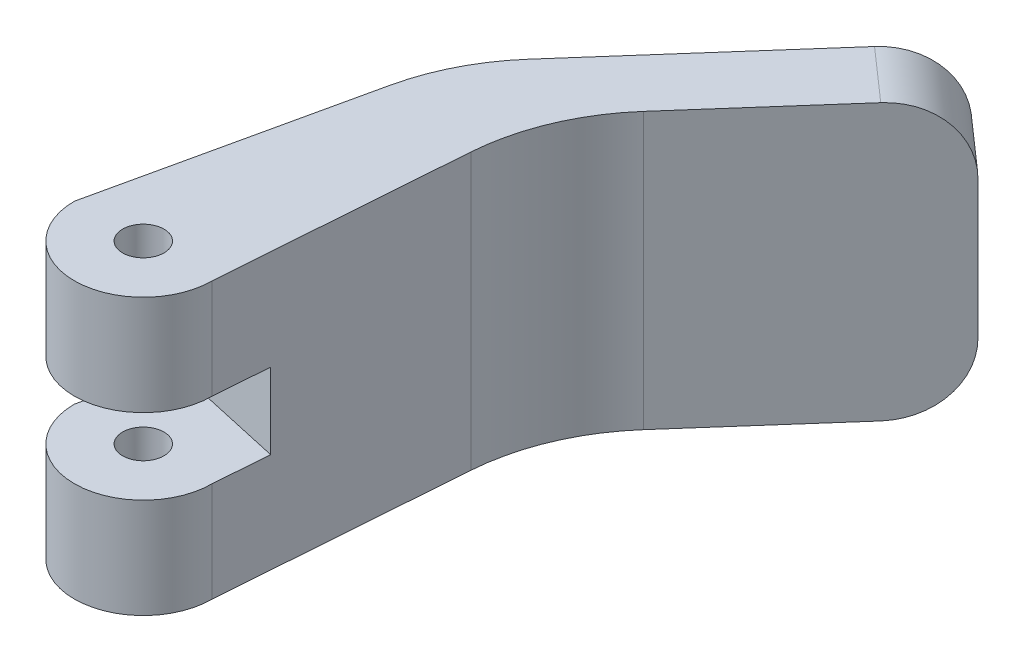
ISO-10303-21;
HEADER;
FILE_DESCRIPTION(('STEP AP214'),'2;1');
FILE_NAME('part.step','',(''),(''),'','','');
FILE_SCHEMA(('AUTOMOTIVE_DESIGN { 1 0 10303 214 1 1 1 1 }'));
ENDSEC;
DATA;
#1=APPLICATION_CONTEXT('core data for automotive mechanical design processes');
#2=APPLICATION_PROTOCOL_DEFINITION('international standard','automotive_design',2000,#1);
#3=PRODUCT_CONTEXT('',#1,'mechanical');
#4=PRODUCT('Part','Part','',(#3));
#5=PRODUCT_RELATED_PRODUCT_CATEGORY('part','',(#4));
#6=PRODUCT_DEFINITION_FORMATION('','',#4);
#7=PRODUCT_DEFINITION_CONTEXT('part definition',#1,'design');
#8=PRODUCT_DEFINITION('design','',#6,#7);
#9=PRODUCT_DEFINITION_SHAPE('','',#8);
#10=(LENGTH_UNIT() NAMED_UNIT(*) SI_UNIT(.MILLI.,.METRE.));
#11=(NAMED_UNIT(*) PLANE_ANGLE_UNIT() SI_UNIT($,.RADIAN.));
#12=(NAMED_UNIT(*) SI_UNIT($,.STERADIAN.) SOLID_ANGLE_UNIT());
#13=UNCERTAINTY_MEASURE_WITH_UNIT(LENGTH_MEASURE(1.E-05),#10,'distance_accuracy_value','');
#14=(GEOMETRIC_REPRESENTATION_CONTEXT(3) GLOBAL_UNCERTAINTY_ASSIGNED_CONTEXT((#13)) GLOBAL_UNIT_ASSIGNED_CONTEXT((#10,
#11,#12)) REPRESENTATION_CONTEXT('',''));
#15=CARTESIAN_POINT('',(0.,0.,0.));
#16=DIRECTION('',(0.,0.,1.));
#17=DIRECTION('',(1.,0.,0.));
#18=AXIS2_PLACEMENT_3D('',#15,#16,#17);
#19=CARTESIAN_POINT('',(0.,40.,0.));
#20=DIRECTION('',(0.,-1.,0.));
#21=DIRECTION('',(0.,0.,-1.));
#22=AXIS2_PLACEMENT_3D('',#19,#20,#21);
#23=CYLINDRICAL_SURFACE('',#22,10.);
#24=DIRECTION('',(0.,-1.,0.));
#25=VECTOR('',#24,1.);
#26=CARTESIAN_POINT('',(-10.,40.,0.));
#27=LINE('',#26,#25);
#28=CARTESIAN_POINT('',(-10.,40.,0.));
#29=VERTEX_POINT('',#28);
#30=CARTESIAN_POINT('',(-10.,25.5,0.));
#31=VERTEX_POINT('',#30);
#32=EDGE_CURVE('E205',#29,#31,#27,.T.);
#33=ORIENTED_EDGE('',*,*,#32,.T.);
#34=CARTESIAN_POINT('',(0.,25.5,0.));
#35=DIRECTION('',(0.,1.,0.));
#36=DIRECTION('',(0.,0.,1.));
#37=AXIS2_PLACEMENT_3D('',#34,#35,#36);
#38=CIRCLE('',#37,10.);
#39=CARTESIAN_POINT('',(10.,25.5,0.));
#40=VERTEX_POINT('',#39);
#41=EDGE_CURVE('E173',#31,#40,#38,.T.);
#42=ORIENTED_EDGE('',*,*,#41,.T.);
#43=DIRECTION('',(0.,-1.,0.));
#44=VECTOR('',#43,1.);
#45=CARTESIAN_POINT('',(10.,40.,0.));
#46=LINE('',#45,#44);
#47=CARTESIAN_POINT('',(10.,40.,0.));
#48=VERTEX_POINT('',#47);
#49=EDGE_CURVE('E215',#48,#40,#46,.T.);
#50=ORIENTED_EDGE('',*,*,#49,.F.);
#51=CARTESIAN_POINT('',(0.,40.,0.));
#52=DIRECTION('',(0.,1.,0.));
#53=DIRECTION('',(0.,0.,1.));
#54=AXIS2_PLACEMENT_3D('',#51,#52,#53);
#55=CIRCLE('',#54,10.);
#56=EDGE_CURVE('E181',#29,#48,#55,.T.);
#57=ORIENTED_EDGE('',*,*,#56,.F.);
#58=EDGE_LOOP('',(#33,#42,#50,#57));
#59=FACE_BOUND('',#58,.T.);
#60=ADVANCED_FACE('F38',(#59),#23,.T.);
#61=CARTESIAN_POINT('',(0.,-10.,0.));
#62=DIRECTION('',(0.,1.,0.));
#63=DIRECTION('',(0.,0.,1.));
#64=AXIS2_PLACEMENT_3D('',#61,#62,#63);
#65=CYLINDRICAL_SURFACE('',#64,3.);
#66=CARTESIAN_POINT('',(0.,25.5,0.));
#67=DIRECTION('',(0.,1.,0.));
#68=DIRECTION('',(0.,0.,1.));
#69=AXIS2_PLACEMENT_3D('',#66,#67,#68);
#70=CIRCLE('',#69,3.);
#71=CARTESIAN_POINT('',(0.,25.5,3.));
#72=VERTEX_POINT('',#71);
#73=EDGE_CURVE('E42',#72,#72,#70,.F.);
#74=ORIENTED_EDGE('',*,*,#73,.T.);
#75=EDGE_LOOP('',(#74));
#76=FACE_BOUND('',#75,.T.);
#77=CARTESIAN_POINT('',(0.,40.,0.));
#78=DIRECTION('',(0.,1.,0.));
#79=DIRECTION('',(0.,0.,1.));
#80=AXIS2_PLACEMENT_3D('',#77,#78,#79);
#81=CIRCLE('',#80,3.);
#82=CARTESIAN_POINT('',(0.,40.,3.));
#83=VERTEX_POINT('',#82);
#84=EDGE_CURVE('E177',#83,#83,#81,.T.);
#85=ORIENTED_EDGE('',*,*,#84,.T.);
#86=EDGE_LOOP('',(#85));
#87=FACE_BOUND('',#86,.T.);
#88=ADVANCED_FACE('F269',(#76,#87),#65,.F.);
#89=CARTESIAN_POINT('',(10.,14.5,0.));
#90=VERTEX_POINT('',#89);
#91=CARTESIAN_POINT('',(10.,0.,0.));
#92=VERTEX_POINT('',#91);
#93=EDGE_CURVE('E214',#90,#92,#46,.T.);
#94=ORIENTED_EDGE('',*,*,#93,.F.);
#95=CARTESIAN_POINT('',(0.,14.5,0.));
#96=DIRECTION('',(0.,-1.,0.));
#97=DIRECTION('',(0.,0.,-1.));
#98=AXIS2_PLACEMENT_3D('',#95,#96,#97);
#99=CIRCLE('',#98,10.);
#100=CARTESIAN_POINT('',(-10.,14.5,0.));
#101=VERTEX_POINT('',#100);
#102=EDGE_CURVE('E168',#90,#101,#99,.T.);
#103=ORIENTED_EDGE('',*,*,#102,.T.);
#104=CARTESIAN_POINT('',(-10.,0.,0.));
#105=VERTEX_POINT('',#104);
#106=EDGE_CURVE('E162',#101,#105,#27,.T.);
#107=ORIENTED_EDGE('',*,*,#106,.T.);
#108=CARTESIAN_POINT('',(0.,0.,0.));
#109=DIRECTION('',(0.,1.,0.));
#110=DIRECTION('',(0.,0.,1.));
#111=AXIS2_PLACEMENT_3D('',#108,#109,#110);
#112=CIRCLE('',#111,10.);
#113=EDGE_CURVE('E194',#105,#92,#112,.T.);
#114=ORIENTED_EDGE('',*,*,#113,.T.);
#115=EDGE_LOOP('',(#94,#103,#107,#114));
#116=FACE_BOUND('',#115,.T.);
#117=ADVANCED_FACE('F272',(#116),#23,.T.);
#118=CARTESIAN_POINT('',(13.3240992667123,40.,-45.));
#119=DIRECTION('',(-0.997282809774378,0.,-0.0736681568150167));
#120=DIRECTION('',(-0.0736681568150167,0.,0.997282809774378));
#121=AXIS2_PLACEMENT_3D('',#118,#119,#120);
#122=PLANE('',#121);
#123=ORIENTED_EDGE('',*,*,#49,.T.);
#124=DIRECTION('',(0.0736681568150167,0.,-0.997282809774378));
#125=VECTOR('',#124,1.);
#126=CARTESIAN_POINT('',(13.3240992667123,25.5,-45.));
#127=LINE('',#126,#125);
#128=CARTESIAN_POINT('',(10.5829852413294,25.5,-7.89216378780778));
#129=VERTEX_POINT('',#128);
#130=EDGE_CURVE('E170',#40,#129,#127,.T.);
#131=ORIENTED_EDGE('',*,*,#130,.T.);
#132=DIRECTION('',(0.,-1.,0.));
#133=VECTOR('',#132,1.);
#134=CARTESIAN_POINT('',(10.5829852413294,40.,-7.89216378780778));
#135=LINE('',#134,#133);
#136=CARTESIAN_POINT('',(10.5829852413294,14.5,-7.89216378780778));
#137=VERTEX_POINT('',#136);
#138=EDGE_CURVE('E175',#129,#137,#135,.T.);
#139=ORIENTED_EDGE('',*,*,#138,.T.);
#140=DIRECTION('',(-0.0736681568150167,0.,0.997282809774378));
#141=VECTOR('',#140,1.);
#142=CARTESIAN_POINT('',(13.3240992667123,14.5,-45.));
#143=LINE('',#142,#141);
#144=EDGE_CURVE('E149',#137,#90,#143,.T.);
#145=ORIENTED_EDGE('',*,*,#144,.T.);
#146=ORIENTED_EDGE('',*,*,#93,.T.);
#147=DIRECTION('',(0.0736681568150167,0.,-0.997282809774378));
#148=VECTOR('',#147,1.);
#149=CARTESIAN_POINT('',(13.3240992667123,0.,-45.));
#150=LINE('',#149,#148);
#151=CARTESIAN_POINT('',(12.5816277252217,0.,-34.9487901274013));
#152=VERTEX_POINT('',#151);
#153=EDGE_CURVE('E197',#92,#152,#150,.T.);
#154=ORIENTED_EDGE('',*,*,#153,.T.);
#155=DIRECTION('',(0.,-1.,0.));
#156=VECTOR('',#155,1.);
#157=CARTESIAN_POINT('',(12.5816277252217,40.,-34.9487901274013));
#158=LINE('',#157,#156);
#159=CARTESIAN_POINT('',(12.5816277252217,40.,-34.9487901274013));
#160=VERTEX_POINT('',#159);
#161=EDGE_CURVE('E63',#152,#160,#158,.F.);
#162=ORIENTED_EDGE('',*,*,#161,.T.);
#163=DIRECTION('',(0.0736681568150167,0.,-0.997282809774378));
#164=VECTOR('',#163,1.);
#165=CARTESIAN_POINT('',(13.3240992667123,40.,-45.));
#166=LINE('',#165,#164);
#167=EDGE_CURVE('E184',#48,#160,#166,.T.);
#168=ORIENTED_EDGE('',*,*,#167,.F.);
#169=EDGE_LOOP('',(#123,#131,#139,#145,#146,#154,#162,#168));
#170=FACE_BOUND('',#169,.T.);
#171=ADVANCED_FACE('F281',(#170),#122,.F.);
#172=CARTESIAN_POINT('',(42.7260146225168,40.,-78.39152010292));
#173=DIRECTION('',(-0.750519776221055,0.,-0.660847989707995));
#174=DIRECTION('',(-0.660847989707995,0.,0.750519776221055));
#175=AXIS2_PLACEMENT_3D('',#172,#173,#174);
#176=PLANE('',#175);
#177=DIRECTION('',(0.660847989707995,0.,-0.750519776221055));
#178=VECTOR('',#177,1.);
#179=CARTESIAN_POINT('',(42.7260146225168,40.,-78.39152010292));
#180=LINE('',#179,#178);
#181=CARTESIAN_POINT('',(19.9845187318214,40.,-52.5641851141907));
#182=VERTEX_POINT('',#181);
#183=CARTESIAN_POINT('',(36.1175347254369,40.,-70.8863223407095));
#184=VERTEX_POINT('',#183);
#185=EDGE_CURVE('E187',#182,#184,#180,.T.);
#186=ORIENTED_EDGE('',*,*,#185,.F.);
#187=DIRECTION('',(0.,-1.,0.));
#188=VECTOR('',#187,1.);
#189=CARTESIAN_POINT('',(19.9845187318214,0.,-52.5641851141907));
#190=LINE('',#189,#188);
#191=CARTESIAN_POINT('',(19.9845187318214,0.,-52.5641851141907));
#192=VERTEX_POINT('',#191);
#193=EDGE_CURVE('E247',#182,#192,#190,.T.);
#194=ORIENTED_EDGE('',*,*,#193,.T.);
#195=DIRECTION('',(0.660847989707995,0.,-0.750519776221055));
#196=VECTOR('',#195,1.);
#197=CARTESIAN_POINT('',(42.7260146225168,0.,-78.39152010292));
#198=LINE('',#197,#196);
#199=CARTESIAN_POINT('',(36.1175347254369,0.,-70.8863223407095));
#200=VERTEX_POINT('',#199);
#201=EDGE_CURVE('E199',#192,#200,#198,.T.);
#202=ORIENTED_EDGE('',*,*,#201,.T.);
#203=CARTESIAN_POINT('',(36.1175347254369,10.,-70.8863223407095));
#204=DIRECTION('',(-0.750519776221055,0.,-0.660847989707995));
#205=DIRECTION('',(-0.660847989707995,0.,0.750519776221055));
#206=AXIS2_PLACEMENT_3D('',#203,#204,#205);
#207=CIRCLE('',#206,10.);
#208=CARTESIAN_POINT('',(42.7260146225168,10.,-78.39152010292));
#209=VERTEX_POINT('',#208);
#210=EDGE_CURVE('E233',#200,#209,#207,.F.);
#211=ORIENTED_EDGE('',*,*,#210,.T.);
#212=DIRECTION('',(0.,-1.,0.));
#213=VECTOR('',#212,1.);
#214=CARTESIAN_POINT('',(42.7260146225168,40.,-78.39152010292));
#215=LINE('',#214,#213);
#216=CARTESIAN_POINT('',(42.7260146225168,30.,-78.39152010292));
#217=VERTEX_POINT('',#216);
#218=EDGE_CURVE('E211',#217,#209,#215,.T.);
#219=ORIENTED_EDGE('',*,*,#218,.F.);
#220=CARTESIAN_POINT('',(36.1175347254369,30.,-70.8863223407095));
#221=DIRECTION('',(-0.750519776221055,0.,-0.660847989707995));
#222=DIRECTION('',(-0.660847989707995,0.,0.750519776221055));
#223=AXIS2_PLACEMENT_3D('',#220,#221,#222);
#224=CIRCLE('',#223,10.);
#225=EDGE_CURVE('E230',#217,#184,#224,.F.);
#226=ORIENTED_EDGE('',*,*,#225,.T.);
#227=EDGE_LOOP('',(#186,#194,#202,#211,#219,#226));
#228=FACE_BOUND('',#227,.T.);
#229=ADVANCED_FACE('F286',(#228),#176,.F.);
#230=CARTESIAN_POINT('',(35.2208168603063,40.,-85.));
#231=DIRECTION('',(-0.660847989707996,0.,0.750519776221054));
#232=DIRECTION('',(0.750519776221054,0.,0.660847989707996));
#233=AXIS2_PLACEMENT_3D('',#230,#231,#232);
#234=PLANE('',#233);
#235=ORIENTED_EDGE('',*,*,#218,.T.);
#236=DIRECTION('',(-0.750519776221054,0.,-0.660847989707996));
#237=VECTOR('',#236,1.);
#238=CARTESIAN_POINT('',(35.2208168603063,10.,-85.));
#239=LINE('',#238,#237);
#240=CARTESIAN_POINT('',(35.2208168603063,10.,-85.));
#241=VERTEX_POINT('',#240);
#242=EDGE_CURVE('E220',#209,#241,#239,.T.);
#243=ORIENTED_EDGE('',*,*,#242,.T.);
#244=DIRECTION('',(0.,-1.,0.));
#245=VECTOR('',#244,1.);
#246=CARTESIAN_POINT('',(35.2208168603063,40.,-85.));
#247=LINE('',#246,#245);
#248=CARTESIAN_POINT('',(35.2208168603063,30.,-85.));
#249=VERTEX_POINT('',#248);
#250=EDGE_CURVE('E208',#249,#241,#247,.T.);
#251=ORIENTED_EDGE('',*,*,#250,.F.);
#252=DIRECTION('',(-0.750519776221054,0.,-0.660847989707996));
#253=VECTOR('',#252,1.);
#254=CARTESIAN_POINT('',(42.7260146225168,30.,-78.39152010292));
#255=LINE('',#254,#253);
#256=EDGE_CURVE('E218',#249,#217,#255,.F.);
#257=ORIENTED_EDGE('',*,*,#256,.T.);
#258=EDGE_LOOP('',(#235,#243,#251,#257));
#259=FACE_BOUND('',#258,.T.);
#260=ADVANCED_FACE('F325',(#259),#234,.F.);
#261=CARTESIAN_POINT('',(0.,40.,-45.));
#262=DIRECTION('',(0.750519776221054,0.,0.660847989707995));
#263=DIRECTION('',(0.660847989707995,0.,-0.750519776221055));
#264=AXIS2_PLACEMENT_3D('',#261,#262,#263);
#265=PLANE('',#264);
#266=DIRECTION('',(-0.660847989707995,0.,0.750519776221055));
#267=VECTOR('',#266,1.);
#268=CARTESIAN_POINT('',(0.,0.,-45.));
#269=LINE('',#268,#267);
#270=CARTESIAN_POINT('',(28.6123369632263,0.,-77.4948022377895));
#271=VERTEX_POINT('',#270);
#272=CARTESIAN_POINT('',(5.0969047384323,0.,-50.7885139446342));
#273=VERTEX_POINT('',#272);
#274=EDGE_CURVE('E201',#271,#273,#269,.T.);
#275=ORIENTED_EDGE('',*,*,#274,.T.);
#276=DIRECTION('',(0.,-1.,0.));
#277=VECTOR('',#276,1.);
#278=CARTESIAN_POINT('',(5.0969047384323,40.,-50.7885139446342));
#279=LINE('',#278,#277);
#280=CARTESIAN_POINT('',(5.0969047384323,40.,-50.7885139446342));
#281=VERTEX_POINT('',#280);
#282=EDGE_CURVE('E243',#273,#281,#279,.F.);
#283=ORIENTED_EDGE('',*,*,#282,.T.);
#284=DIRECTION('',(-0.660847989707995,0.,0.750519776221055));
#285=VECTOR('',#284,1.);
#286=CARTESIAN_POINT('',(0.,40.,-45.));
#287=LINE('',#286,#285);
#288=CARTESIAN_POINT('',(28.6123369632263,40.,-77.4948022377895));
#289=VERTEX_POINT('',#288);
#290=EDGE_CURVE('E189',#289,#281,#287,.T.);
#291=ORIENTED_EDGE('',*,*,#290,.F.);
#292=CARTESIAN_POINT('',(28.6123369632263,30.,-77.4948022377895));
#293=DIRECTION('',(0.750519776221054,0.,0.660847989707995));
#294=DIRECTION('',(0.660847989707995,0.,-0.750519776221055));
#295=AXIS2_PLACEMENT_3D('',#292,#293,#294);
#296=CIRCLE('',#295,10.);
#297=EDGE_CURVE('E223',#289,#249,#296,.F.);
#298=ORIENTED_EDGE('',*,*,#297,.T.);
#299=ORIENTED_EDGE('',*,*,#250,.T.);
#300=CARTESIAN_POINT('',(28.6123369632263,10.,-77.4948022377895));
#301=DIRECTION('',(0.750519776221054,0.,0.660847989707995));
#302=DIRECTION('',(0.660847989707995,0.,-0.750519776221055));
#303=AXIS2_PLACEMENT_3D('',#300,#301,#302);
#304=CIRCLE('',#303,10.);
#305=EDGE_CURVE('E225',#241,#271,#304,.F.);
#306=ORIENTED_EDGE('',*,*,#305,.T.);
#307=EDGE_LOOP('',(#275,#283,#291,#298,#299,#306));
#308=FACE_BOUND('',#307,.T.);
#309=ADVANCED_FACE('F318',(#308),#265,.F.);
#310=CARTESIAN_POINT('',(-10.,40.,0.));
#311=DIRECTION('',(0.976187060183953,0.,0.216930457818656));
#312=DIRECTION('',(0.216930457818656,0.,-0.976187060183953));
#313=AXIS2_PLACEMENT_3D('',#310,#311,#312);
#314=PLANE('',#313);
#315=DIRECTION('',(0.,-1.,0.));
#316=VECTOR('',#315,1.);
#317=CARTESIAN_POINT('',(-7.36010718651932,25.5,-11.8795176606631));
#318=LINE('',#317,#316);
#319=CARTESIAN_POINT('',(-7.36010718651932,25.5,-11.8795176606631));
#320=VERTEX_POINT('',#319);
#321=CARTESIAN_POINT('',(-7.36010718651932,14.5,-11.8795176606631));
#322=VERTEX_POINT('',#321);
#323=EDGE_CURVE('E156',#320,#322,#318,.T.);
#324=ORIENTED_EDGE('',*,*,#323,.F.);
#325=DIRECTION('',(0.216930457818656,0.,-0.976187060183953));
#326=VECTOR('',#325,1.);
#327=CARTESIAN_POINT('',(-11.6987163428924,25.5,7.644223543016));
#328=LINE('',#327,#326);
#329=EDGE_CURVE('E55',#31,#320,#328,.T.);
#330=ORIENTED_EDGE('',*,*,#329,.F.);
#331=ORIENTED_EDGE('',*,*,#32,.F.);
#332=DIRECTION('',(-0.216930457818656,0.,0.976187060183953));
#333=VECTOR('',#332,1.);
#334=CARTESIAN_POINT('',(-10.,40.,0.));
#335=LINE('',#334,#333);
#336=CARTESIAN_POINT('',(-1.67311378045464,40.,-37.4709879879541));
#337=VERTEX_POINT('',#336);
#338=EDGE_CURVE('E192',#337,#29,#335,.T.);
#339=ORIENTED_EDGE('',*,*,#338,.F.);
#340=DIRECTION('',(0.,-1.,0.));
#341=VECTOR('',#340,1.);
#342=CARTESIAN_POINT('',(-1.67311378045465,40.,-37.4709879879541));
#343=LINE('',#342,#341);
#344=CARTESIAN_POINT('',(-1.67311378045464,0.,-37.4709879879541));
#345=VERTEX_POINT('',#344);
#346=EDGE_CURVE('E238',#337,#345,#343,.T.);
#347=ORIENTED_EDGE('',*,*,#346,.T.);
#348=DIRECTION('',(-0.216930457818656,0.,0.976187060183953));
#349=VECTOR('',#348,1.);
#350=CARTESIAN_POINT('',(-10.,0.,0.));
#351=LINE('',#350,#349);
#352=EDGE_CURVE('E185',#345,#105,#351,.T.);
#353=ORIENTED_EDGE('',*,*,#352,.T.);
#354=ORIENTED_EDGE('',*,*,#106,.F.);
#355=DIRECTION('',(-0.216930457818656,0.,0.976187060183953));
#356=VECTOR('',#355,1.);
#357=CARTESIAN_POINT('',(-7.36010718651932,14.5,-11.8795176606631));
#358=LINE('',#357,#356);
#359=EDGE_CURVE('E146',#322,#101,#358,.T.);
#360=ORIENTED_EDGE('',*,*,#359,.F.);
#361=EDGE_LOOP('',(#324,#330,#331,#339,#347,#353,#354,#360));
#362=FACE_BOUND('',#361,.T.);
#363=ADVANCED_FACE('F160',(#362),#314,.F.);
#364=CARTESIAN_POINT('',(0.,40.,0.));
#365=DIRECTION('',(0.,1.,0.));
#366=DIRECTION('',(0.,0.,1.));
#367=AXIS2_PLACEMENT_3D('',#364,#365,#366);
#368=PLANE('',#367);
#369=ORIENTED_EDGE('',*,*,#84,.F.);
#370=EDGE_LOOP('',(#369));
#371=FACE_BOUND('',#370,.T.);
#372=ORIENTED_EDGE('',*,*,#290,.T.);
#373=CARTESIAN_POINT('',(27.6124980250639,40.,-30.9630742533944));
#374=DIRECTION('',(0.,1.,0.));
#375=DIRECTION('',(0.,0.,1.));
#376=AXIS2_PLACEMENT_3D('',#373,#374,#375);
#377=CIRCLE('',#376,30.);
#378=EDGE_CURVE('E245',#281,#337,#377,.T.);
#379=ORIENTED_EDGE('',*,*,#378,.T.);
#380=ORIENTED_EDGE('',*,*,#338,.T.);
#381=ORIENTED_EDGE('',*,*,#56,.T.);
#382=ORIENTED_EDGE('',*,*,#167,.T.);
#383=CARTESIAN_POINT('',(42.500112018453,40.,-32.7387454229508));
#384=DIRECTION('',(0.,1.,0.));
#385=DIRECTION('',(0.,0.,1.));
#386=AXIS2_PLACEMENT_3D('',#383,#384,#385);
#387=CIRCLE('',#386,30.);
#388=EDGE_CURVE('E11',#160,#182,#387,.F.);
#389=ORIENTED_EDGE('',*,*,#388,.T.);
#390=ORIENTED_EDGE('',*,*,#185,.T.);
#391=DIRECTION('',(-0.750519776221054,0.,-0.660847989707996));
#392=VECTOR('',#391,1.);
#393=CARTESIAN_POINT('',(28.6123369632263,40.,-77.4948022377895));
#394=LINE('',#393,#392);
#395=EDGE_CURVE('E235',#184,#289,#394,.T.);
#396=ORIENTED_EDGE('',*,*,#395,.T.);
#397=EDGE_LOOP('',(#372,#379,#380,#381,#382,#389,#390,#396));
#398=FACE_BOUND('',#397,.T.);
#399=ADVANCED_FACE('F303',(#371,#398),#368,.T.);
#400=CARTESIAN_POINT('',(0.,0.,0.));
#401=DIRECTION('',(0.,1.,0.));
#402=DIRECTION('',(0.,0.,1.));
#403=AXIS2_PLACEMENT_3D('',#400,#401,#402);
#404=PLANE('',#403);
#405=CARTESIAN_POINT('',(0.,0.,0.));
#406=DIRECTION('',(0.,1.,0.));
#407=DIRECTION('',(0.,0.,1.));
#408=AXIS2_PLACEMENT_3D('',#405,#406,#407);
#409=CIRCLE('',#408,3.);
#410=CARTESIAN_POINT('',(0.,0.,3.));
#411=VERTEX_POINT('',#410);
#412=EDGE_CURVE('E180',#411,#411,#409,.T.);
#413=ORIENTED_EDGE('',*,*,#412,.T.);
#414=EDGE_LOOP('',(#413));
#415=FACE_BOUND('',#414,.T.);
#416=ORIENTED_EDGE('',*,*,#352,.F.);
#417=CARTESIAN_POINT('',(27.6124980250639,0.,-30.9630742533944));
#418=DIRECTION('',(0.,1.,0.));
#419=DIRECTION('',(0.,0.,1.));
#420=AXIS2_PLACEMENT_3D('',#417,#418,#419);
#421=CIRCLE('',#420,30.);
#422=EDGE_CURVE('E241',#345,#273,#421,.F.);
#423=ORIENTED_EDGE('',*,*,#422,.T.);
#424=ORIENTED_EDGE('',*,*,#274,.F.);
#425=DIRECTION('',(-0.750519776221054,0.,-0.660847989707996));
#426=VECTOR('',#425,1.);
#427=CARTESIAN_POINT('',(50.9314138040564,0.,-57.84239929024));
#428=LINE('',#427,#426);
#429=EDGE_CURVE('E227',#271,#200,#428,.F.);
#430=ORIENTED_EDGE('',*,*,#429,.T.);
#431=ORIENTED_EDGE('',*,*,#201,.F.);
#432=CARTESIAN_POINT('',(42.500112018453,0.,-32.7387454229508));
#433=DIRECTION('',(0.,1.,0.));
#434=DIRECTION('',(0.,0.,1.));
#435=AXIS2_PLACEMENT_3D('',#432,#433,#434);
#436=CIRCLE('',#435,30.);
#437=EDGE_CURVE('E47',#192,#152,#436,.T.);
#438=ORIENTED_EDGE('',*,*,#437,.T.);
#439=ORIENTED_EDGE('',*,*,#153,.F.);
#440=ORIENTED_EDGE('',*,*,#113,.F.);
#441=EDGE_LOOP('',(#416,#423,#424,#430,#431,#438,#439,#440));
#442=FACE_BOUND('',#441,.T.);
#443=ADVANCED_FACE('F292',(#415,#442),#404,.F.);
#444=CARTESIAN_POINT('',(28.6123369632263,10.,-77.4948022377895));
#445=DIRECTION('',(-0.750519776221054,0.,-0.660847989707996));
#446=DIRECTION('',(-0.660847989707996,0.,0.750519776221054));
#447=AXIS2_PLACEMENT_3D('',#444,#445,#446);
#448=CYLINDRICAL_SURFACE('',#447,10.);
#449=ORIENTED_EDGE('',*,*,#210,.F.);
#450=ORIENTED_EDGE('',*,*,#429,.F.);
#451=ORIENTED_EDGE('',*,*,#305,.F.);
#452=ORIENTED_EDGE('',*,*,#242,.F.);
#453=EDGE_LOOP('',(#449,#450,#451,#452));
#454=FACE_BOUND('',#453,.T.);
#455=ADVANCED_FACE('F323',(#454),#448,.T.);
#456=CARTESIAN_POINT('',(50.9314138040564,30.,-57.84239929024));
#457=DIRECTION('',(0.750519776221054,0.,0.660847989707996));
#458=DIRECTION('',(0.660847989707996,0.,-0.750519776221054));
#459=AXIS2_PLACEMENT_3D('',#456,#457,#458);
#460=CYLINDRICAL_SURFACE('',#459,10.);
#461=ORIENTED_EDGE('',*,*,#225,.F.);
#462=ORIENTED_EDGE('',*,*,#256,.F.);
#463=ORIENTED_EDGE('',*,*,#297,.F.);
#464=ORIENTED_EDGE('',*,*,#395,.F.);
#465=EDGE_LOOP('',(#461,#462,#463,#464));
#466=FACE_BOUND('',#465,.T.);
#467=ADVANCED_FACE('F328',(#466),#460,.T.);
#468=CARTESIAN_POINT('',(27.6124980250639,40.,-30.9630742533944));
#469=DIRECTION('',(0.,-1.,0.));
#470=DIRECTION('',(0.,0.,-1.));
#471=AXIS2_PLACEMENT_3D('',#468,#469,#470);
#472=CYLINDRICAL_SURFACE('',#471,30.);
#473=ORIENTED_EDGE('',*,*,#378,.F.);
#474=ORIENTED_EDGE('',*,*,#282,.F.);
#475=ORIENTED_EDGE('',*,*,#422,.F.);
#476=ORIENTED_EDGE('',*,*,#346,.F.);
#477=EDGE_LOOP('',(#473,#474,#475,#476));
#478=FACE_BOUND('',#477,.T.);
#479=ADVANCED_FACE('F313',(#478),#472,.T.);
#480=CARTESIAN_POINT('',(42.500112018453,40.,-32.7387454229508));
#481=DIRECTION('',(0.,1.,0.));
#482=DIRECTION('',(0.,0.,1.));
#483=AXIS2_PLACEMENT_3D('',#480,#481,#482);
#484=CYLINDRICAL_SURFACE('',#483,30.);
#485=ORIENTED_EDGE('',*,*,#388,.F.);
#486=ORIENTED_EDGE('',*,*,#161,.F.);
#487=ORIENTED_EDGE('',*,*,#437,.F.);
#488=ORIENTED_EDGE('',*,*,#193,.F.);
#489=EDGE_LOOP('',(#485,#486,#487,#488));
#490=FACE_BOUND('',#489,.T.);
#491=ADVANCED_FACE('F40',(#490),#484,.F.);
#492=CARTESIAN_POINT('',(0.,14.5,0.));
#493=DIRECTION('',(0.,-1.,0.));
#494=DIRECTION('',(0.,0.,-1.));
#495=AXIS2_PLACEMENT_3D('',#492,#493,#494);
#496=CIRCLE('',#495,3.);
#497=CARTESIAN_POINT('',(0.,14.5,-3.));
#498=VERTEX_POINT('',#497);
#499=EDGE_CURVE('E152',#498,#498,#496,.F.);
#500=ORIENTED_EDGE('',*,*,#499,.T.);
#501=EDGE_LOOP('',(#500));
#502=FACE_BOUND('',#501,.T.);
#503=ORIENTED_EDGE('',*,*,#412,.F.);
#504=EDGE_LOOP('',(#503));
#505=FACE_BOUND('',#504,.T.);
#506=ADVANCED_FACE('F256',(#502,#505),#65,.F.);
#507=CARTESIAN_POINT('',(41.4492458226783,25.5,-1.03299476973025));
#508=DIRECTION('',(0.216930457818656,0.,-0.976187060183953));
#509=DIRECTION('',(-0.976187060183953,0.,-0.216930457818656));
#510=AXIS2_PLACEMENT_3D('',#507,#508,#509);
#511=PLANE('',#510);
#512=DIRECTION('',(-0.976187060183953,0.,-0.216930457818656));
#513=VECTOR('',#512,1.);
#514=CARTESIAN_POINT('',(41.4492458226783,25.5,-1.03299476973025));
#515=LINE('',#514,#513);
#516=EDGE_CURVE('E153',#129,#320,#515,.T.);
#517=ORIENTED_EDGE('',*,*,#516,.T.);
#518=ORIENTED_EDGE('',*,*,#323,.T.);
#519=DIRECTION('',(-0.976187060183953,0.,-0.216930457818656));
#520=VECTOR('',#519,1.);
#521=CARTESIAN_POINT('',(41.4492458226783,14.5,-1.03299476973024));
#522=LINE('',#521,#520);
#523=EDGE_CURVE('E142',#137,#322,#522,.T.);
#524=ORIENTED_EDGE('',*,*,#523,.F.);
#525=ORIENTED_EDGE('',*,*,#138,.F.);
#526=EDGE_LOOP('',(#517,#518,#524,#525));
#527=FACE_BOUND('',#526,.T.);
#528=ADVANCED_FACE('F157',(#527),#511,.F.);
#529=CARTESIAN_POINT('',(37.1106366663052,25.5,18.4907464339488));
#530=DIRECTION('',(0.,1.,0.));
#531=DIRECTION('',(0.,0.,1.));
#532=AXIS2_PLACEMENT_3D('',#529,#530,#531);
#533=PLANE('',#532);
#534=ORIENTED_EDGE('',*,*,#73,.F.);
#535=EDGE_LOOP('',(#534));
#536=FACE_BOUND('',#535,.T.);
#537=ORIENTED_EDGE('',*,*,#329,.T.);
#538=ORIENTED_EDGE('',*,*,#516,.F.);
#539=ORIENTED_EDGE('',*,*,#130,.F.);
#540=ORIENTED_EDGE('',*,*,#41,.F.);
#541=EDGE_LOOP('',(#537,#538,#539,#540));
#542=FACE_BOUND('',#541,.T.);
#543=ADVANCED_FACE('F260',(#536,#542),#533,.F.);
#544=CARTESIAN_POINT('',(41.4492458226783,14.5,-1.03299476973024));
#545=DIRECTION('',(0.,-1.,0.));
#546=DIRECTION('',(0.,0.,-1.));
#547=AXIS2_PLACEMENT_3D('',#544,#545,#546);
#548=PLANE('',#547);
#549=ORIENTED_EDGE('',*,*,#499,.F.);
#550=EDGE_LOOP('',(#549));
#551=FACE_BOUND('',#550,.T.);
#552=ORIENTED_EDGE('',*,*,#102,.F.);
#553=ORIENTED_EDGE('',*,*,#144,.F.);
#554=ORIENTED_EDGE('',*,*,#523,.T.);
#555=ORIENTED_EDGE('',*,*,#359,.T.);
#556=EDGE_LOOP('',(#552,#553,#554,#555));
#557=FACE_BOUND('',#556,.T.);
#558=ADVANCED_FACE('F144',(#551,#557),#548,.F.);
#559=CLOSED_SHELL('',(#60,#88,#117,#171,#229,#260,#309,#363,#399,#443,#455,#467,#479,#491,#506,
#528,#543,#558));
#560=MANIFOLD_SOLID_BREP('B2',#559);
#561=ADVANCED_BREP_SHAPE_REPRESENTATION('',(#18,#560),#14);
#562=SHAPE_DEFINITION_REPRESENTATION(#9,#561);
ENDSEC;
END-ISO-10303-21;
